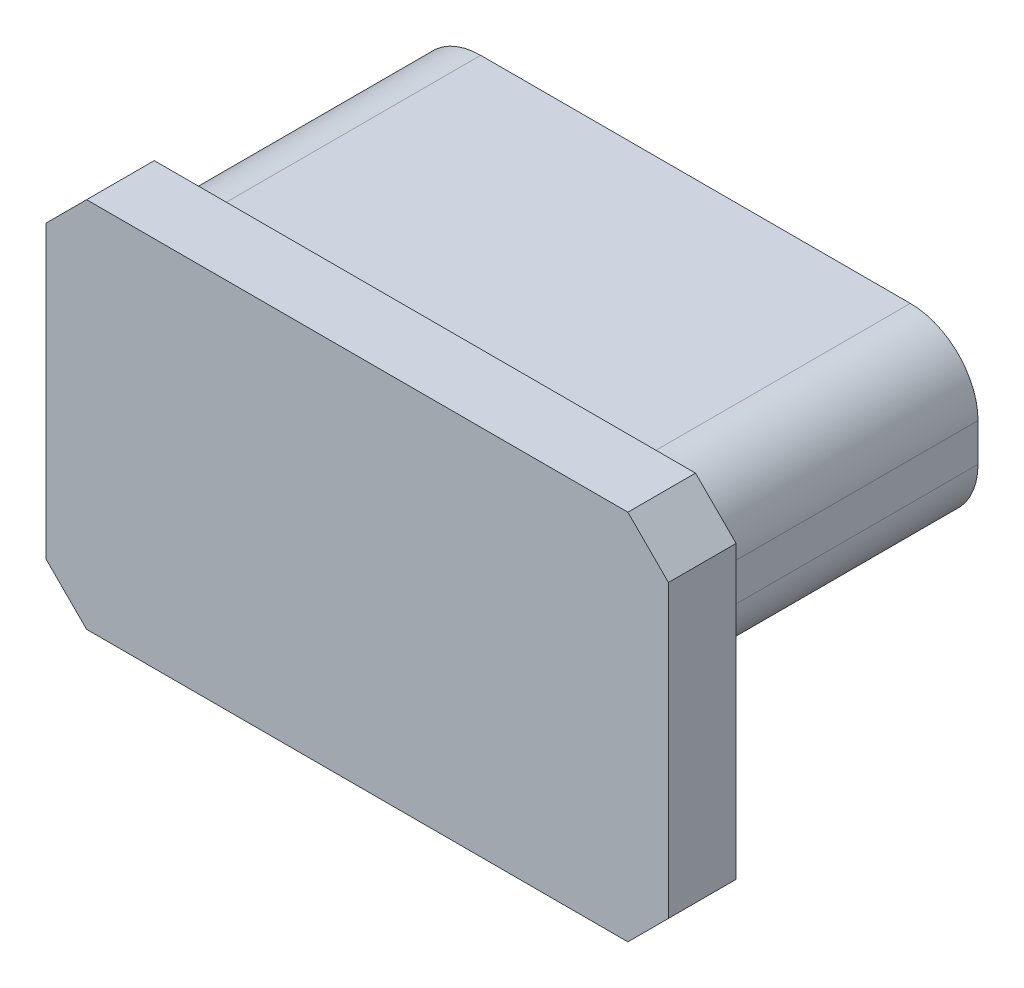
ISO-10303-21;
HEADER;
FILE_DESCRIPTION(('STEP AP214'),'2;1');
FILE_NAME('part.step','',(''),(''),'','','');
FILE_SCHEMA(('AUTOMOTIVE_DESIGN { 1 0 10303 214 1 1 1 1 }'));
ENDSEC;
DATA;
#1=APPLICATION_CONTEXT('core data for automotive mechanical design processes');
#2=APPLICATION_PROTOCOL_DEFINITION('international standard','automotive_design',2000,#1);
#3=PRODUCT_CONTEXT('',#1,'mechanical');
#4=PRODUCT('Part','Part','',(#3));
#5=PRODUCT_RELATED_PRODUCT_CATEGORY('part','',(#4));
#6=PRODUCT_DEFINITION_FORMATION('','',#4);
#7=PRODUCT_DEFINITION_CONTEXT('part definition',#1,'design');
#8=PRODUCT_DEFINITION('design','',#6,#7);
#9=PRODUCT_DEFINITION_SHAPE('','',#8);
#10=(LENGTH_UNIT() NAMED_UNIT(*) SI_UNIT(.MILLI.,.METRE.));
#11=(NAMED_UNIT(*) PLANE_ANGLE_UNIT() SI_UNIT($,.RADIAN.));
#12=(NAMED_UNIT(*) SI_UNIT($,.STERADIAN.) SOLID_ANGLE_UNIT());
#13=UNCERTAINTY_MEASURE_WITH_UNIT(LENGTH_MEASURE(1.E-05),#10,'distance_accuracy_value','');
#14=(GEOMETRIC_REPRESENTATION_CONTEXT(3) GLOBAL_UNCERTAINTY_ASSIGNED_CONTEXT((#13)) GLOBAL_UNIT_ASSIGNED_CONTEXT((#10,
#11,#12)) REPRESENTATION_CONTEXT('',''));
#15=CARTESIAN_POINT('',(0.,0.,0.));
#16=DIRECTION('',(0.,0.,1.));
#17=DIRECTION('',(1.,0.,0.));
#18=AXIS2_PLACEMENT_3D('',#15,#16,#17);
#19=CARTESIAN_POINT('',(-1.3,-1.86,5.));
#20=DIRECTION('',(0.,0.,-1.));
#21=DIRECTION('',(-1.,0.,0.));
#22=AXIS2_PLACEMENT_3D('',#19,#20,#21);
#23=CYLINDRICAL_SURFACE('',#22,1.00000000000004);
#24=CARTESIAN_POINT('',(-1.3,-1.86,4.));
#25=DIRECTION('',(0.,0.,1.));
#26=DIRECTION('',(1.,0.,0.));
#27=AXIS2_PLACEMENT_3D('',#24,#25,#26);
#28=CIRCLE('',#27,1.00000000000004);
#29=CARTESIAN_POINT('',(-1.3,-2.86000000000004,4.));
#30=VERTEX_POINT('',#29);
#31=CARTESIAN_POINT('',(-0.299999999999964,-1.86,4.));
#32=VERTEX_POINT('',#31);
#33=EDGE_CURVE('E172',#30,#32,#28,.T.);
#34=ORIENTED_EDGE('',*,*,#33,.F.);
#35=DIRECTION('',(0.,0.,-1.));
#36=VECTOR('',#35,1.);
#37=CARTESIAN_POINT('',(-1.3,-2.86000000000004,5.));
#38=LINE('',#37,#36);
#39=CARTESIAN_POINT('',(-1.3,-2.86000000000004,0.));
#40=VERTEX_POINT('',#39);
#41=EDGE_CURVE('E156',#30,#40,#38,.T.);
#42=ORIENTED_EDGE('',*,*,#41,.T.);
#43=CARTESIAN_POINT('',(-1.3,-1.86,0.));
#44=DIRECTION('',(0.,0.,1.));
#45=DIRECTION('',(1.,0.,0.));
#46=AXIS2_PLACEMENT_3D('',#43,#44,#45);
#47=CIRCLE('',#46,1.00000000000004);
#48=CARTESIAN_POINT('',(-0.299999999999964,-1.86,0.));
#49=VERTEX_POINT('',#48);
#50=EDGE_CURVE('E176',#40,#49,#47,.T.);
#51=ORIENTED_EDGE('',*,*,#50,.T.);
#52=DIRECTION('',(0.,0.,-1.));
#53=VECTOR('',#52,1.);
#54=CARTESIAN_POINT('',(-0.299999999999964,-1.86,5.));
#55=LINE('',#54,#53);
#56=EDGE_CURVE('E173',#32,#49,#55,.T.);
#57=ORIENTED_EDGE('',*,*,#56,.F.);
#58=EDGE_LOOP('',(#34,#42,#51,#57));
#59=FACE_BOUND('',#58,.T.);
#60=ADVANCED_FACE('F41',(#59),#23,.T.);
#61=CARTESIAN_POINT('',(-0.299999999999964,-1.86,5.));
#62=DIRECTION('',(-1.,0.,0.));
#63=DIRECTION('',(0.,-1.,0.));
#64=AXIS2_PLACEMENT_3D('',#61,#62,#63);
#65=PLANE('',#64);
#66=DIRECTION('',(0.,1.,0.));
#67=VECTOR('',#66,1.);
#68=CARTESIAN_POINT('',(-0.299999999999964,-1.86,4.));
#69=LINE('',#68,#67);
#70=CARTESIAN_POINT('',(-0.299999999999963,-1.3,4.));
#71=VERTEX_POINT('',#70);
#72=EDGE_CURVE('E177',#32,#71,#69,.T.);
#73=ORIENTED_EDGE('',*,*,#72,.F.);
#74=ORIENTED_EDGE('',*,*,#56,.T.);
#75=DIRECTION('',(0.,1.,0.));
#76=VECTOR('',#75,1.);
#77=CARTESIAN_POINT('',(-0.299999999999964,-1.86,0.));
#78=LINE('',#77,#76);
#79=CARTESIAN_POINT('',(-0.299999999999963,-1.3,0.));
#80=VERTEX_POINT('',#79);
#81=EDGE_CURVE('E264',#49,#80,#78,.T.);
#82=ORIENTED_EDGE('',*,*,#81,.T.);
#83=DIRECTION('',(0.,0.,-1.));
#84=VECTOR('',#83,1.);
#85=CARTESIAN_POINT('',(-0.299999999999963,-1.3,5.));
#86=LINE('',#85,#84);
#87=EDGE_CURVE('E190',#71,#80,#86,.T.);
#88=ORIENTED_EDGE('',*,*,#87,.F.);
#89=EDGE_LOOP('',(#73,#74,#82,#88));
#90=FACE_BOUND('',#89,.T.);
#91=ADVANCED_FACE('F299',(#90),#65,.F.);
#92=CARTESIAN_POINT('',(-1.3,-1.3,5.));
#93=DIRECTION('',(0.,0.,-1.));
#94=DIRECTION('',(-1.,0.,0.));
#95=AXIS2_PLACEMENT_3D('',#92,#93,#94);
#96=CYLINDRICAL_SURFACE('',#95,1.00000000000004);
#97=CARTESIAN_POINT('',(-1.3,-1.3,4.));
#98=DIRECTION('',(0.,0.,1.));
#99=DIRECTION('',(1.,0.,0.));
#100=AXIS2_PLACEMENT_3D('',#97,#98,#99);
#101=CIRCLE('',#100,1.00000000000004);
#102=CARTESIAN_POINT('',(-1.3,-0.299999999999963,4.));
#103=VERTEX_POINT('',#102);
#104=EDGE_CURVE('E259',#71,#103,#101,.T.);
#105=ORIENTED_EDGE('',*,*,#104,.F.);
#106=ORIENTED_EDGE('',*,*,#87,.T.);
#107=CARTESIAN_POINT('',(-1.3,-1.3,0.));
#108=DIRECTION('',(0.,0.,1.));
#109=DIRECTION('',(1.,0.,0.));
#110=AXIS2_PLACEMENT_3D('',#107,#108,#109);
#111=CIRCLE('',#110,1.00000000000004);
#112=CARTESIAN_POINT('',(-1.3,-0.299999999999963,0.));
#113=VERTEX_POINT('',#112);
#114=EDGE_CURVE('E267',#80,#113,#111,.T.);
#115=ORIENTED_EDGE('',*,*,#114,.T.);
#116=DIRECTION('',(0.,0.,-1.));
#117=VECTOR('',#116,1.);
#118=CARTESIAN_POINT('',(-1.3,-0.299999999999963,5.));
#119=LINE('',#118,#117);
#120=EDGE_CURVE('E291',#103,#113,#119,.T.);
#121=ORIENTED_EDGE('',*,*,#120,.F.);
#122=EDGE_LOOP('',(#105,#106,#115,#121));
#123=FACE_BOUND('',#122,.T.);
#124=ADVANCED_FACE('F294',(#123),#96,.T.);
#125=CARTESIAN_POINT('',(-7.65,-0.299999999999964,5.));
#126=DIRECTION('',(0.,-1.,0.));
#127=DIRECTION('',(1.,0.,0.));
#128=AXIS2_PLACEMENT_3D('',#125,#126,#127);
#129=PLANE('',#128);
#130=DIRECTION('',(-1.,0.,0.));
#131=VECTOR('',#130,1.);
#132=CARTESIAN_POINT('',(-7.65,-0.299999999999964,4.));
#133=LINE('',#132,#131);
#134=CARTESIAN_POINT('',(-7.65,-0.299999999999964,4.));
#135=VERTEX_POINT('',#134);
#136=EDGE_CURVE('E256',#103,#135,#133,.T.);
#137=ORIENTED_EDGE('',*,*,#136,.F.);
#138=ORIENTED_EDGE('',*,*,#120,.T.);
#139=DIRECTION('',(-1.,0.,0.));
#140=VECTOR('',#139,1.);
#141=CARTESIAN_POINT('',(-7.65,-0.299999999999964,0.));
#142=LINE('',#141,#140);
#143=CARTESIAN_POINT('',(-7.65,-0.299999999999964,0.));
#144=VERTEX_POINT('',#143);
#145=EDGE_CURVE('E270',#113,#144,#142,.T.);
#146=ORIENTED_EDGE('',*,*,#145,.T.);
#147=DIRECTION('',(0.,0.,-1.));
#148=VECTOR('',#147,1.);
#149=CARTESIAN_POINT('',(-7.65,-0.299999999999964,5.));
#150=LINE('',#149,#148);
#151=EDGE_CURVE('E289',#135,#144,#150,.T.);
#152=ORIENTED_EDGE('',*,*,#151,.F.);
#153=EDGE_LOOP('',(#137,#138,#146,#152));
#154=FACE_BOUND('',#153,.T.);
#155=ADVANCED_FACE('F307',(#154),#129,.F.);
#156=CARTESIAN_POINT('',(-7.65,-1.3,5.));
#157=DIRECTION('',(0.,0.,-1.));
#158=DIRECTION('',(-1.,0.,0.));
#159=AXIS2_PLACEMENT_3D('',#156,#157,#158);
#160=CYLINDRICAL_SURFACE('',#159,1.00000000000004);
#161=CARTESIAN_POINT('',(-7.65,-1.3,4.));
#162=DIRECTION('',(0.,0.,1.));
#163=DIRECTION('',(1.,0.,0.));
#164=AXIS2_PLACEMENT_3D('',#161,#162,#163);
#165=CIRCLE('',#164,1.00000000000004);
#166=CARTESIAN_POINT('',(-8.65000000000004,-1.3,4.));
#167=VERTEX_POINT('',#166);
#168=EDGE_CURVE('E253',#135,#167,#165,.T.);
#169=ORIENTED_EDGE('',*,*,#168,.F.);
#170=ORIENTED_EDGE('',*,*,#151,.T.);
#171=CARTESIAN_POINT('',(-7.65,-1.3,0.));
#172=DIRECTION('',(0.,0.,1.));
#173=DIRECTION('',(1.,0.,0.));
#174=AXIS2_PLACEMENT_3D('',#171,#172,#173);
#175=CIRCLE('',#174,1.00000000000004);
#176=CARTESIAN_POINT('',(-8.65000000000004,-1.3,0.));
#177=VERTEX_POINT('',#176);
#178=EDGE_CURVE('E273',#144,#177,#175,.T.);
#179=ORIENTED_EDGE('',*,*,#178,.T.);
#180=DIRECTION('',(0.,0.,-1.));
#181=VECTOR('',#180,1.);
#182=CARTESIAN_POINT('',(-8.65000000000004,-1.3,5.));
#183=LINE('',#182,#181);
#184=EDGE_CURVE('E287',#167,#177,#183,.T.);
#185=ORIENTED_EDGE('',*,*,#184,.F.);
#186=EDGE_LOOP('',(#169,#170,#179,#185));
#187=FACE_BOUND('',#186,.T.);
#188=ADVANCED_FACE('F310',(#187),#160,.T.);
#189=CARTESIAN_POINT('',(-8.65000000000004,-1.3,5.));
#190=DIRECTION('',(1.,0.,0.));
#191=DIRECTION('',(0.,0.,-1.));
#192=AXIS2_PLACEMENT_3D('',#189,#190,#191);
#193=PLANE('',#192);
#194=DIRECTION('',(0.,-1.,0.));
#195=VECTOR('',#194,1.);
#196=CARTESIAN_POINT('',(-8.65000000000004,-1.3,4.));
#197=LINE('',#196,#195);
#198=CARTESIAN_POINT('',(-8.65000000000004,-1.86,4.));
#199=VERTEX_POINT('',#198);
#200=EDGE_CURVE('E251',#167,#199,#197,.T.);
#201=ORIENTED_EDGE('',*,*,#200,.F.);
#202=ORIENTED_EDGE('',*,*,#184,.T.);
#203=DIRECTION('',(0.,-1.,0.));
#204=VECTOR('',#203,1.);
#205=CARTESIAN_POINT('',(-8.65000000000004,-1.3,0.));
#206=LINE('',#205,#204);
#207=CARTESIAN_POINT('',(-8.65000000000004,-1.86,0.));
#208=VERTEX_POINT('',#207);
#209=EDGE_CURVE('E276',#177,#208,#206,.T.);
#210=ORIENTED_EDGE('',*,*,#209,.T.);
#211=DIRECTION('',(0.,0.,-1.));
#212=VECTOR('',#211,1.);
#213=CARTESIAN_POINT('',(-8.65000000000004,-1.86,5.));
#214=LINE('',#213,#212);
#215=EDGE_CURVE('E285',#199,#208,#214,.T.);
#216=ORIENTED_EDGE('',*,*,#215,.F.);
#217=EDGE_LOOP('',(#201,#202,#210,#216));
#218=FACE_BOUND('',#217,.T.);
#219=ADVANCED_FACE('F312',(#218),#193,.F.);
#220=CARTESIAN_POINT('',(-7.65,-1.86,5.));
#221=DIRECTION('',(0.,0.,-1.));
#222=DIRECTION('',(-1.,0.,0.));
#223=AXIS2_PLACEMENT_3D('',#220,#221,#222);
#224=CYLINDRICAL_SURFACE('',#223,1.00000000000004);
#225=CARTESIAN_POINT('',(-7.65,-1.86,4.));
#226=DIRECTION('',(0.,0.,1.));
#227=DIRECTION('',(1.,0.,0.));
#228=AXIS2_PLACEMENT_3D('',#225,#226,#227);
#229=CIRCLE('',#228,1.00000000000004);
#230=CARTESIAN_POINT('',(-7.65,-2.86000000000004,4.));
#231=VERTEX_POINT('',#230);
#232=EDGE_CURVE('E182',#199,#231,#229,.T.);
#233=ORIENTED_EDGE('',*,*,#232,.F.);
#234=ORIENTED_EDGE('',*,*,#215,.T.);
#235=CARTESIAN_POINT('',(-7.65,-1.86,0.));
#236=DIRECTION('',(0.,0.,1.));
#237=DIRECTION('',(1.,0.,0.));
#238=AXIS2_PLACEMENT_3D('',#235,#236,#237);
#239=CIRCLE('',#238,1.00000000000004);
#240=CARTESIAN_POINT('',(-7.65,-2.86000000000004,0.));
#241=VERTEX_POINT('',#240);
#242=EDGE_CURVE('E279',#208,#241,#239,.T.);
#243=ORIENTED_EDGE('',*,*,#242,.T.);
#244=DIRECTION('',(0.,0.,-1.));
#245=VECTOR('',#244,1.);
#246=CARTESIAN_POINT('',(-7.65,-2.86000000000004,5.));
#247=LINE('',#246,#245);
#248=EDGE_CURVE('E168',#231,#241,#247,.T.);
#249=ORIENTED_EDGE('',*,*,#248,.F.);
#250=EDGE_LOOP('',(#233,#234,#243,#249));
#251=FACE_BOUND('',#250,.T.);
#252=ADVANCED_FACE('F316',(#251),#224,.T.);
#253=CARTESIAN_POINT('',(-1.3,-2.86000000000004,5.));
#254=DIRECTION('',(0.,1.,0.));
#255=DIRECTION('',(-1.,0.,0.));
#256=AXIS2_PLACEMENT_3D('',#253,#254,#255);
#257=PLANE('',#256);
#258=DIRECTION('',(1.,0.,0.));
#259=VECTOR('',#258,1.);
#260=CARTESIAN_POINT('',(-1.3,-2.86000000000004,4.));
#261=LINE('',#260,#259);
#262=EDGE_CURVE('E160',#231,#30,#261,.T.);
#263=ORIENTED_EDGE('',*,*,#262,.F.);
#264=ORIENTED_EDGE('',*,*,#248,.T.);
#265=DIRECTION('',(1.,0.,0.));
#266=VECTOR('',#265,1.);
#267=CARTESIAN_POINT('',(-1.3,-2.86000000000004,0.));
#268=LINE('',#267,#266);
#269=EDGE_CURVE('E163',#241,#40,#268,.T.);
#270=ORIENTED_EDGE('',*,*,#269,.T.);
#271=ORIENTED_EDGE('',*,*,#41,.F.);
#272=EDGE_LOOP('',(#263,#264,#270,#271));
#273=FACE_BOUND('',#272,.T.);
#274=ADVANCED_FACE('F158',(#273),#257,.F.);
#275=CARTESIAN_POINT('',(-1.3,-1.86,0.));
#276=DIRECTION('',(0.,0.,1.));
#277=DIRECTION('',(1.,0.,0.));
#278=AXIS2_PLACEMENT_3D('',#275,#276,#277);
#279=PLANE('',#278);
#280=ORIENTED_EDGE('',*,*,#50,.F.);
#281=ORIENTED_EDGE('',*,*,#269,.F.);
#282=ORIENTED_EDGE('',*,*,#242,.F.);
#283=ORIENTED_EDGE('',*,*,#209,.F.);
#284=ORIENTED_EDGE('',*,*,#178,.F.);
#285=ORIENTED_EDGE('',*,*,#145,.F.);
#286=ORIENTED_EDGE('',*,*,#114,.F.);
#287=ORIENTED_EDGE('',*,*,#81,.F.);
#288=EDGE_LOOP('',(#280,#281,#282,#283,#284,#285,#286,#287));
#289=FACE_BOUND('',#288,.T.);
#290=ADVANCED_FACE('F302',(#289),#279,.F.);
#291=CARTESIAN_POINT('',(0.,0.,4.));
#292=DIRECTION('',(0.,0.,1.));
#293=DIRECTION('',(1.,0.,0.));
#294=AXIS2_PLACEMENT_3D('',#291,#292,#293);
#295=PLANE('',#294);
#296=DIRECTION('',(1.,0.,0.));
#297=VECTOR('',#296,1.);
#298=CARTESIAN_POINT('',(0.125000000000002,-5.56000000000004,4.));
#299=LINE('',#298,#297);
#300=CARTESIAN_POINT('',(-8.47499999999999,-5.56000000000004,4.));
#301=VERTEX_POINT('',#300);
#302=CARTESIAN_POINT('',(-0.475,-5.56000000000004,4.));
#303=VERTEX_POINT('',#302);
#304=EDGE_CURVE('E242',#301,#303,#299,.T.);
#305=ORIENTED_EDGE('',*,*,#304,.F.);
#306=DIRECTION('',(0.70710678118655,-0.707106781186545,0.));
#307=VECTOR('',#306,1.);
#308=CARTESIAN_POINT('',(-9.075,-4.96000000000004,4.));
#309=LINE('',#308,#307);
#310=CARTESIAN_POINT('',(-9.075,-4.96000000000004,4.));
#311=VERTEX_POINT('',#310);
#312=EDGE_CURVE('E214',#301,#311,#309,.F.);
#313=ORIENTED_EDGE('',*,*,#312,.T.);
#314=DIRECTION('',(0.,-1.,0.));
#315=VECTOR('',#314,1.);
#316=CARTESIAN_POINT('',(-9.075,-5.56000000000004,4.));
#317=LINE('',#316,#315);
#318=CARTESIAN_POINT('',(-9.075,-0.660000000000041,4.));
#319=VERTEX_POINT('',#318);
#320=EDGE_CURVE('E365',#319,#311,#317,.T.);
#321=ORIENTED_EDGE('',*,*,#320,.F.);
#322=DIRECTION('',(-0.707106781186547,-0.707106781186548,0.));
#323=VECTOR('',#322,1.);
#324=CARTESIAN_POINT('',(-8.475,-0.0600000000000374,4.));
#325=LINE('',#324,#323);
#326=CARTESIAN_POINT('',(-8.475,-0.0600000000000374,4.));
#327=VERTEX_POINT('',#326);
#328=EDGE_CURVE('E57',#319,#327,#325,.F.);
#329=ORIENTED_EDGE('',*,*,#328,.T.);
#330=DIRECTION('',(-1.,0.,0.));
#331=VECTOR('',#330,1.);
#332=CARTESIAN_POINT('',(0.125,-0.0600000000000364,4.));
#333=LINE('',#332,#331);
#334=CARTESIAN_POINT('',(-0.475000000000001,-0.0600000000000365,4.));
#335=VERTEX_POINT('',#334);
#336=EDGE_CURVE('E367',#335,#327,#333,.T.);
#337=ORIENTED_EDGE('',*,*,#336,.F.);
#338=DIRECTION('',(-0.707106781186549,0.707106781186547,0.));
#339=VECTOR('',#338,1.);
#340=CARTESIAN_POINT('',(0.125,-0.660000000000036,4.));
#341=LINE('',#340,#339);
#342=CARTESIAN_POINT('',(0.125,-0.660000000000036,4.));
#343=VERTEX_POINT('',#342);
#344=EDGE_CURVE('E209',#335,#343,#341,.F.);
#345=ORIENTED_EDGE('',*,*,#344,.T.);
#346=DIRECTION('',(0.,1.,0.));
#347=VECTOR('',#346,1.);
#348=CARTESIAN_POINT('',(0.125000000000002,-5.56000000000004,4.));
#349=LINE('',#348,#347);
#350=CARTESIAN_POINT('',(0.125000000000002,-4.96000000000003,4.));
#351=VERTEX_POINT('',#350);
#352=EDGE_CURVE('E229',#351,#343,#349,.T.);
#353=ORIENTED_EDGE('',*,*,#352,.F.);
#354=DIRECTION('',(0.707106781186547,0.707106781186549,0.));
#355=VECTOR('',#354,1.);
#356=CARTESIAN_POINT('',(-0.475,-5.56000000000004,4.));
#357=LINE('',#356,#355);
#358=EDGE_CURVE('E211',#351,#303,#357,.F.);
#359=ORIENTED_EDGE('',*,*,#358,.T.);
#360=EDGE_LOOP('',(#305,#313,#321,#329,#337,#345,#353,#359));
#361=FACE_BOUND('',#360,.T.);
#362=ORIENTED_EDGE('',*,*,#262,.T.);
#363=ORIENTED_EDGE('',*,*,#33,.T.);
#364=ORIENTED_EDGE('',*,*,#72,.T.);
#365=ORIENTED_EDGE('',*,*,#104,.T.);
#366=ORIENTED_EDGE('',*,*,#136,.T.);
#367=ORIENTED_EDGE('',*,*,#168,.T.);
#368=ORIENTED_EDGE('',*,*,#200,.T.);
#369=ORIENTED_EDGE('',*,*,#232,.T.);
#370=EDGE_LOOP('',(#362,#363,#364,#365,#366,#367,#368,#369));
#371=FACE_BOUND('',#370,.T.);
#372=ADVANCED_FACE('F180',(#361,#371),#295,.F.);
#373=CARTESIAN_POINT('',(0.125000000000002,-5.56000000000004,4.));
#374=DIRECTION('',(1.,0.,0.));
#375=DIRECTION('',(0.,1.,0.));
#376=AXIS2_PLACEMENT_3D('',#373,#374,#375);
#377=PLANE('',#376);
#378=DIRECTION('',(0.,1.,0.));
#379=VECTOR('',#378,1.);
#380=CARTESIAN_POINT('',(0.125000000000002,-5.56000000000004,5.));
#381=LINE('',#380,#379);
#382=CARTESIAN_POINT('',(0.125000000000002,-4.96000000000003,5.));
#383=VERTEX_POINT('',#382);
#384=CARTESIAN_POINT('',(0.125,-0.660000000000036,5.));
#385=VERTEX_POINT('',#384);
#386=EDGE_CURVE('E226',#383,#385,#381,.T.);
#387=ORIENTED_EDGE('',*,*,#386,.F.);
#388=DIRECTION('',(0.,0.,-1.));
#389=VECTOR('',#388,1.);
#390=CARTESIAN_POINT('',(0.125000000000002,-4.96000000000003,4.));
#391=LINE('',#390,#389);
#392=EDGE_CURVE('E11',#383,#351,#391,.T.);
#393=ORIENTED_EDGE('',*,*,#392,.T.);
#394=ORIENTED_EDGE('',*,*,#352,.T.);
#395=DIRECTION('',(0.,0.,1.));
#396=VECTOR('',#395,1.);
#397=CARTESIAN_POINT('',(0.125,-0.660000000000036,4.));
#398=LINE('',#397,#396);
#399=EDGE_CURVE('E50',#343,#385,#398,.T.);
#400=ORIENTED_EDGE('',*,*,#399,.T.);
#401=EDGE_LOOP('',(#387,#393,#394,#400));
#402=FACE_BOUND('',#401,.T.);
#403=ADVANCED_FACE('F225',(#402),#377,.T.);
#404=CARTESIAN_POINT('',(0.125000000000002,-5.56000000000004,4.));
#405=DIRECTION('',(0.,-1.,0.));
#406=DIRECTION('',(1.,0.,0.));
#407=AXIS2_PLACEMENT_3D('',#404,#405,#406);
#408=PLANE('',#407);
#409=DIRECTION('',(1.,0.,0.));
#410=VECTOR('',#409,1.);
#411=CARTESIAN_POINT('',(0.125000000000002,-5.56000000000004,5.));
#412=LINE('',#411,#410);
#413=CARTESIAN_POINT('',(-8.47499999999999,-5.56000000000004,5.));
#414=VERTEX_POINT('',#413);
#415=CARTESIAN_POINT('',(-0.475,-5.56000000000004,5.));
#416=VERTEX_POINT('',#415);
#417=EDGE_CURVE('E247',#414,#416,#412,.T.);
#418=ORIENTED_EDGE('',*,*,#417,.F.);
#419=DIRECTION('',(0.,0.,-1.));
#420=VECTOR('',#419,1.);
#421=CARTESIAN_POINT('',(-8.475,-5.56000000000004,4.));
#422=LINE('',#421,#420);
#423=EDGE_CURVE('E207',#414,#301,#422,.T.);
#424=ORIENTED_EDGE('',*,*,#423,.T.);
#425=ORIENTED_EDGE('',*,*,#304,.T.);
#426=DIRECTION('',(0.,0.,1.));
#427=VECTOR('',#426,1.);
#428=CARTESIAN_POINT('',(-0.475,-5.56000000000004,4.));
#429=LINE('',#428,#427);
#430=EDGE_CURVE('E204',#303,#416,#429,.T.);
#431=ORIENTED_EDGE('',*,*,#430,.T.);
#432=EDGE_LOOP('',(#418,#424,#425,#431));
#433=FACE_BOUND('',#432,.T.);
#434=ADVANCED_FACE('F362',(#433),#408,.T.);
#435=CARTESIAN_POINT('',(-9.075,-5.56000000000004,4.));
#436=DIRECTION('',(-1.,0.,0.));
#437=DIRECTION('',(0.,0.,1.));
#438=AXIS2_PLACEMENT_3D('',#435,#436,#437);
#439=PLANE('',#438);
#440=ORIENTED_EDGE('',*,*,#320,.T.);
#441=DIRECTION('',(0.,0.,1.));
#442=VECTOR('',#441,1.);
#443=CARTESIAN_POINT('',(-9.075,-4.96000000000004,4.));
#444=LINE('',#443,#442);
#445=CARTESIAN_POINT('',(-9.075,-4.96000000000004,5.));
#446=VERTEX_POINT('',#445);
#447=EDGE_CURVE('E188',#311,#446,#444,.T.);
#448=ORIENTED_EDGE('',*,*,#447,.T.);
#449=DIRECTION('',(0.,-1.,0.));
#450=VECTOR('',#449,1.);
#451=CARTESIAN_POINT('',(-9.075,-5.56000000000004,5.));
#452=LINE('',#451,#450);
#453=CARTESIAN_POINT('',(-9.075,-0.660000000000041,5.));
#454=VERTEX_POINT('',#453);
#455=EDGE_CURVE('E239',#454,#446,#452,.T.);
#456=ORIENTED_EDGE('',*,*,#455,.F.);
#457=DIRECTION('',(0.,0.,-1.));
#458=VECTOR('',#457,1.);
#459=CARTESIAN_POINT('',(-9.075,-0.660000000000041,4.));
#460=LINE('',#459,#458);
#461=EDGE_CURVE('E184',#454,#319,#460,.T.);
#462=ORIENTED_EDGE('',*,*,#461,.T.);
#463=EDGE_LOOP('',(#440,#448,#456,#462));
#464=FACE_BOUND('',#463,.T.);
#465=ADVANCED_FACE('F376',(#464),#439,.T.);
#466=CARTESIAN_POINT('',(0.125,-0.0600000000000364,4.));
#467=DIRECTION('',(0.,1.,0.));
#468=DIRECTION('',(-1.,0.,0.));
#469=AXIS2_PLACEMENT_3D('',#466,#467,#468);
#470=PLANE('',#469);
#471=ORIENTED_EDGE('',*,*,#336,.T.);
#472=DIRECTION('',(0.,0.,1.));
#473=VECTOR('',#472,1.);
#474=CARTESIAN_POINT('',(-8.475,-0.0600000000000374,4.));
#475=LINE('',#474,#473);
#476=CARTESIAN_POINT('',(-8.475,-0.0600000000000374,5.));
#477=VERTEX_POINT('',#476);
#478=EDGE_CURVE('E217',#327,#477,#475,.T.);
#479=ORIENTED_EDGE('',*,*,#478,.T.);
#480=DIRECTION('',(-1.,0.,0.));
#481=VECTOR('',#480,1.);
#482=CARTESIAN_POINT('',(0.125,-0.0600000000000364,5.));
#483=LINE('',#482,#481);
#484=CARTESIAN_POINT('',(-0.475000000000001,-0.0600000000000365,5.));
#485=VERTEX_POINT('',#484);
#486=EDGE_CURVE('E237',#485,#477,#483,.T.);
#487=ORIENTED_EDGE('',*,*,#486,.F.);
#488=DIRECTION('',(0.,0.,-1.));
#489=VECTOR('',#488,1.);
#490=CARTESIAN_POINT('',(-0.475000000000001,-0.0600000000000365,4.));
#491=LINE('',#490,#489);
#492=EDGE_CURVE('E64',#485,#335,#491,.T.);
#493=ORIENTED_EDGE('',*,*,#492,.T.);
#494=EDGE_LOOP('',(#471,#479,#487,#493));
#495=FACE_BOUND('',#494,.T.);
#496=ADVANCED_FACE('F373',(#495),#470,.T.);
#497=CARTESIAN_POINT('',(-1.3,-1.86,5.));
#498=DIRECTION('',(0.,0.,1.));
#499=DIRECTION('',(1.,0.,0.));
#500=AXIS2_PLACEMENT_3D('',#497,#498,#499);
#501=PLANE('',#500);
#502=ORIENTED_EDGE('',*,*,#455,.T.);
#503=DIRECTION('',(-0.70710678118655,0.707106781186545,0.));
#504=VECTOR('',#503,1.);
#505=CARTESIAN_POINT('',(-6.7375,-7.29750000000003,5.));
#506=LINE('',#505,#504);
#507=EDGE_CURVE('E202',#446,#414,#506,.F.);
#508=ORIENTED_EDGE('',*,*,#507,.T.);
#509=ORIENTED_EDGE('',*,*,#417,.T.);
#510=DIRECTION('',(-0.707106781186547,-0.707106781186549,0.));
#511=VECTOR('',#510,1.);
#512=CARTESIAN_POINT('',(0.96250000000002,-4.12250000000001,5.));
#513=LINE('',#512,#511);
#514=EDGE_CURVE('E198',#416,#383,#513,.F.);
#515=ORIENTED_EDGE('',*,*,#514,.T.);
#516=ORIENTED_EDGE('',*,*,#386,.T.);
#517=DIRECTION('',(0.707106781186549,-0.707106781186547,0.));
#518=VECTOR('',#517,1.);
#519=CARTESIAN_POINT('',(0.0124999999999798,-0.547500000000016,5.));
#520=LINE('',#519,#518);
#521=EDGE_CURVE('E196',#385,#485,#520,.F.);
#522=ORIENTED_EDGE('',*,*,#521,.T.);
#523=ORIENTED_EDGE('',*,*,#486,.T.);
#524=DIRECTION('',(0.707106781186547,0.707106781186548,0.));
#525=VECTOR('',#524,1.);
#526=CARTESIAN_POINT('',(-5.78749999999998,2.62749999999998,5.));
#527=LINE('',#526,#525);
#528=EDGE_CURVE('E200',#477,#454,#527,.F.);
#529=ORIENTED_EDGE('',*,*,#528,.T.);
#530=EDGE_LOOP('',(#502,#508,#509,#515,#516,#522,#523,#529));
#531=FACE_BOUND('',#530,.T.);
#532=ADVANCED_FACE('F234',(#531),#501,.T.);
#533=CARTESIAN_POINT('',(-9.075,-4.96000000000004,4.));
#534=DIRECTION('',(0.707106781186545,0.70710678118655,0.));
#535=DIRECTION('',(0.,0.,1.));
#536=AXIS2_PLACEMENT_3D('',#533,#534,#535);
#537=PLANE('',#536);
#538=ORIENTED_EDGE('',*,*,#312,.F.);
#539=ORIENTED_EDGE('',*,*,#423,.F.);
#540=ORIENTED_EDGE('',*,*,#507,.F.);
#541=ORIENTED_EDGE('',*,*,#447,.F.);
#542=EDGE_LOOP('',(#538,#539,#540,#541));
#543=FACE_BOUND('',#542,.T.);
#544=ADVANCED_FACE('F334',(#543),#537,.F.);
#545=CARTESIAN_POINT('',(-8.475,-0.0600000000000374,4.));
#546=DIRECTION('',(0.707106781186547,-0.707106781186547,0.));
#547=DIRECTION('',(0.,0.,1.));
#548=AXIS2_PLACEMENT_3D('',#545,#546,#547);
#549=PLANE('',#548);
#550=ORIENTED_EDGE('',*,*,#328,.F.);
#551=ORIENTED_EDGE('',*,*,#461,.F.);
#552=ORIENTED_EDGE('',*,*,#528,.F.);
#553=ORIENTED_EDGE('',*,*,#478,.F.);
#554=EDGE_LOOP('',(#550,#551,#552,#553));
#555=FACE_BOUND('',#554,.T.);
#556=ADVANCED_FACE('F340',(#555),#549,.F.);
#557=CARTESIAN_POINT('',(-0.475,-5.56000000000004,4.));
#558=DIRECTION('',(-0.707106781186549,0.707106781186547,0.));
#559=DIRECTION('',(0.,0.,1.));
#560=AXIS2_PLACEMENT_3D('',#557,#558,#559);
#561=PLANE('',#560);
#562=ORIENTED_EDGE('',*,*,#358,.F.);
#563=ORIENTED_EDGE('',*,*,#392,.F.);
#564=ORIENTED_EDGE('',*,*,#514,.F.);
#565=ORIENTED_EDGE('',*,*,#430,.F.);
#566=EDGE_LOOP('',(#562,#563,#564,#565));
#567=FACE_BOUND('',#566,.T.);
#568=ADVANCED_FACE('F346',(#567),#561,.F.);
#569=CARTESIAN_POINT('',(0.125,-0.660000000000036,4.));
#570=DIRECTION('',(-0.707106781186547,-0.707106781186549,0.));
#571=DIRECTION('',(0.,0.,1.));
#572=AXIS2_PLACEMENT_3D('',#569,#570,#571);
#573=PLANE('',#572);
#574=ORIENTED_EDGE('',*,*,#344,.F.);
#575=ORIENTED_EDGE('',*,*,#492,.F.);
#576=ORIENTED_EDGE('',*,*,#521,.F.);
#577=ORIENTED_EDGE('',*,*,#399,.F.);
#578=EDGE_LOOP('',(#574,#575,#576,#577));
#579=FACE_BOUND('',#578,.T.);
#580=ADVANCED_FACE('F44',(#579),#573,.F.);
#581=CLOSED_SHELL('',(#60,#91,#124,#155,#188,#219,#252,#274,#290,#372,#403,#434,#465,#496,#532,
#544,#556,#568,#580));
#582=MANIFOLD_SOLID_BREP('B2',#581);
#583=ADVANCED_BREP_SHAPE_REPRESENTATION('',(#18,#582),#14);
#584=SHAPE_DEFINITION_REPRESENTATION(#9,#583);
ENDSEC;
END-ISO-10303-21;
